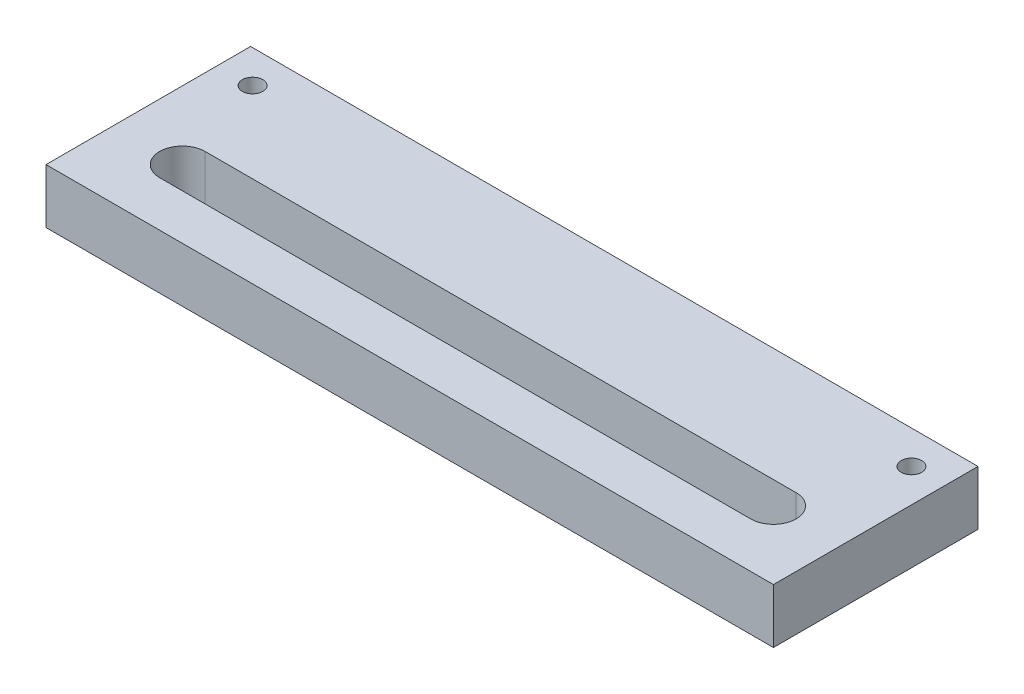
ISO-10303-21;
HEADER;
FILE_DESCRIPTION(('STEP AP214'),'2;1');
FILE_NAME('part.step','',(''),(''),'','','');
FILE_SCHEMA(('AUTOMOTIVE_DESIGN { 1 0 10303 214 1 1 1 1 }'));
ENDSEC;
DATA;
#1=APPLICATION_CONTEXT('core data for automotive mechanical design processes');
#2=APPLICATION_PROTOCOL_DEFINITION('international standard','automotive_design',2000,#1);
#3=PRODUCT_CONTEXT('',#1,'mechanical');
#4=PRODUCT('Part','Part','',(#3));
#5=PRODUCT_RELATED_PRODUCT_CATEGORY('part','',(#4));
#6=PRODUCT_DEFINITION_FORMATION('','',#4);
#7=PRODUCT_DEFINITION_CONTEXT('part definition',#1,'design');
#8=PRODUCT_DEFINITION('design','',#6,#7);
#9=PRODUCT_DEFINITION_SHAPE('','',#8);
#10=(LENGTH_UNIT() NAMED_UNIT(*) SI_UNIT(.MILLI.,.METRE.));
#11=(NAMED_UNIT(*) PLANE_ANGLE_UNIT() SI_UNIT($,.RADIAN.));
#12=(NAMED_UNIT(*) SI_UNIT($,.STERADIAN.) SOLID_ANGLE_UNIT());
#13=UNCERTAINTY_MEASURE_WITH_UNIT(LENGTH_MEASURE(1.E-05),#10,'distance_accuracy_value','');
#14=(GEOMETRIC_REPRESENTATION_CONTEXT(3) GLOBAL_UNCERTAINTY_ASSIGNED_CONTEXT((#13)) GLOBAL_UNIT_ASSIGNED_CONTEXT((#10,
#11,#12)) REPRESENTATION_CONTEXT('',''));
#15=CARTESIAN_POINT('',(0.,0.,0.));
#16=DIRECTION('',(0.,0.,1.));
#17=DIRECTION('',(1.,0.,0.));
#18=AXIS2_PLACEMENT_3D('',#15,#16,#17);
#19=CARTESIAN_POINT('',(0.,12.,0.));
#20=DIRECTION('',(-1.,0.,0.));
#21=DIRECTION('',(0.,0.,1.));
#22=AXIS2_PLACEMENT_3D('',#19,#20,#21);
#23=PLANE('',#22);
#24=DIRECTION('',(0.,0.,-1.));
#25=VECTOR('',#24,1.);
#26=CARTESIAN_POINT('',(0.,0.,0.));
#27=LINE('',#26,#25);
#28=CARTESIAN_POINT('',(0.,0.,45.));
#29=VERTEX_POINT('',#28);
#30=CARTESIAN_POINT('',(0.,0.,0.));
#31=VERTEX_POINT('',#30);
#32=EDGE_CURVE('E165',#29,#31,#27,.T.);
#33=ORIENTED_EDGE('',*,*,#32,.T.);
#34=DIRECTION('',(0.,-1.,0.));
#35=VECTOR('',#34,1.);
#36=CARTESIAN_POINT('',(0.,12.,0.));
#37=LINE('',#36,#35);
#38=CARTESIAN_POINT('',(0.,12.,0.));
#39=VERTEX_POINT('',#38);
#40=EDGE_CURVE('E11',#39,#31,#37,.T.);
#41=ORIENTED_EDGE('',*,*,#40,.F.);
#42=DIRECTION('',(0.,0.,-1.));
#43=VECTOR('',#42,1.);
#44=CARTESIAN_POINT('',(0.,12.,0.));
#45=LINE('',#44,#43);
#46=CARTESIAN_POINT('',(0.,12.,45.));
#47=VERTEX_POINT('',#46);
#48=EDGE_CURVE('E162',#47,#39,#45,.T.);
#49=ORIENTED_EDGE('',*,*,#48,.F.);
#50=DIRECTION('',(0.,-1.,0.));
#51=VECTOR('',#50,1.);
#52=CARTESIAN_POINT('',(0.,12.,45.));
#53=LINE('',#52,#51);
#54=EDGE_CURVE('E172',#47,#29,#53,.T.);
#55=ORIENTED_EDGE('',*,*,#54,.T.);
#56=EDGE_LOOP('',(#33,#41,#49,#55));
#57=FACE_BOUND('',#56,.T.);
#58=ADVANCED_FACE('F36',(#57),#23,.F.);
#59=CARTESIAN_POINT('',(0.,12.,0.));
#60=DIRECTION('',(0.,0.,1.));
#61=DIRECTION('',(1.,0.,0.));
#62=AXIS2_PLACEMENT_3D('',#59,#60,#61);
#63=PLANE('',#62);
#64=DIRECTION('',(-1.,0.,0.));
#65=VECTOR('',#64,1.);
#66=CARTESIAN_POINT('',(0.,0.,0.));
#67=LINE('',#66,#65);
#68=CARTESIAN_POINT('',(-160.,0.,0.));
#69=VERTEX_POINT('',#68);
#70=EDGE_CURVE('E178',#31,#69,#67,.T.);
#71=ORIENTED_EDGE('',*,*,#70,.T.);
#72=DIRECTION('',(0.,-1.,0.));
#73=VECTOR('',#72,1.);
#74=CARTESIAN_POINT('',(-160.,12.,0.));
#75=LINE('',#74,#73);
#76=CARTESIAN_POINT('',(-160.,12.,0.));
#77=VERTEX_POINT('',#76);
#78=EDGE_CURVE('E44',#77,#69,#75,.T.);
#79=ORIENTED_EDGE('',*,*,#78,.F.);
#80=DIRECTION('',(-1.,0.,0.));
#81=VECTOR('',#80,1.);
#82=CARTESIAN_POINT('',(0.,12.,0.));
#83=LINE('',#82,#81);
#84=EDGE_CURVE('E167',#39,#77,#83,.T.);
#85=ORIENTED_EDGE('',*,*,#84,.F.);
#86=ORIENTED_EDGE('',*,*,#40,.T.);
#87=EDGE_LOOP('',(#71,#79,#85,#86));
#88=FACE_BOUND('',#87,.T.);
#89=ADVANCED_FACE('F202',(#88),#63,.F.);
#90=CARTESIAN_POINT('',(-160.,12.,0.));
#91=DIRECTION('',(1.,0.,0.));
#92=DIRECTION('',(0.,0.,-1.));
#93=AXIS2_PLACEMENT_3D('',#90,#91,#92);
#94=PLANE('',#93);
#95=DIRECTION('',(0.,0.,1.));
#96=VECTOR('',#95,1.);
#97=CARTESIAN_POINT('',(-160.,0.,0.));
#98=LINE('',#97,#96);
#99=CARTESIAN_POINT('',(-160.,0.,45.));
#100=VERTEX_POINT('',#99);
#101=EDGE_CURVE('E176',#69,#100,#98,.T.);
#102=ORIENTED_EDGE('',*,*,#101,.T.);
#103=DIRECTION('',(0.,-1.,0.));
#104=VECTOR('',#103,1.);
#105=CARTESIAN_POINT('',(-160.,12.,45.));
#106=LINE('',#105,#104);
#107=CARTESIAN_POINT('',(-160.,12.,45.));
#108=VERTEX_POINT('',#107);
#109=EDGE_CURVE('E181',#108,#100,#106,.T.);
#110=ORIENTED_EDGE('',*,*,#109,.F.);
#111=DIRECTION('',(0.,0.,1.));
#112=VECTOR('',#111,1.);
#113=CARTESIAN_POINT('',(-160.,12.,0.));
#114=LINE('',#113,#112);
#115=EDGE_CURVE('E166',#77,#108,#114,.T.);
#116=ORIENTED_EDGE('',*,*,#115,.F.);
#117=ORIENTED_EDGE('',*,*,#78,.T.);
#118=EDGE_LOOP('',(#102,#110,#116,#117));
#119=FACE_BOUND('',#118,.T.);
#120=ADVANCED_FACE('F186',(#119),#94,.F.);
#121=CARTESIAN_POINT('',(0.,12.,45.));
#122=DIRECTION('',(0.,0.,-1.));
#123=DIRECTION('',(-1.,0.,0.));
#124=AXIS2_PLACEMENT_3D('',#121,#122,#123);
#125=PLANE('',#124);
#126=DIRECTION('',(1.,0.,0.));
#127=VECTOR('',#126,1.);
#128=CARTESIAN_POINT('',(0.,0.,45.));
#129=LINE('',#128,#127);
#130=EDGE_CURVE('E170',#100,#29,#129,.T.);
#131=ORIENTED_EDGE('',*,*,#130,.T.);
#132=ORIENTED_EDGE('',*,*,#54,.F.);
#133=DIRECTION('',(1.,0.,0.));
#134=VECTOR('',#133,1.);
#135=CARTESIAN_POINT('',(0.,12.,45.));
#136=LINE('',#135,#134);
#137=EDGE_CURVE('E173',#108,#47,#136,.T.);
#138=ORIENTED_EDGE('',*,*,#137,.F.);
#139=ORIENTED_EDGE('',*,*,#109,.T.);
#140=EDGE_LOOP('',(#131,#132,#138,#139));
#141=FACE_BOUND('',#140,.T.);
#142=ADVANCED_FACE('F200',(#141),#125,.F.);
#143=CARTESIAN_POINT('',(0.,12.,0.));
#144=DIRECTION('',(0.,-1.,0.));
#145=DIRECTION('',(0.,0.,-1.));
#146=AXIS2_PLACEMENT_3D('',#143,#144,#145);
#147=PLANE('',#146);
#148=DIRECTION('',(1.,0.,0.));
#149=VECTOR('',#148,1.);
#150=CARTESIAN_POINT('',(0.,12.,35.));
#151=LINE('',#150,#149);
#152=CARTESIAN_POINT('',(-145.,12.,35.));
#153=VERTEX_POINT('',#152);
#154=CARTESIAN_POINT('',(-15.,12.,35.));
#155=VERTEX_POINT('',#154);
#156=EDGE_CURVE('E112',#153,#155,#151,.T.);
#157=ORIENTED_EDGE('',*,*,#156,.F.);
#158=CARTESIAN_POINT('',(-145.,12.,30.));
#159=DIRECTION('',(0.,-1.,0.));
#160=DIRECTION('',(0.,0.,-1.));
#161=AXIS2_PLACEMENT_3D('',#158,#159,#160);
#162=CIRCLE('',#161,4.99999999999999);
#163=CARTESIAN_POINT('',(-145.,12.,25.));
#164=VERTEX_POINT('',#163);
#165=EDGE_CURVE('E104',#153,#164,#162,.T.);
#166=ORIENTED_EDGE('',*,*,#165,.T.);
#167=DIRECTION('',(1.,0.,0.));
#168=VECTOR('',#167,1.);
#169=CARTESIAN_POINT('',(0.,12.,25.));
#170=LINE('',#169,#168);
#171=CARTESIAN_POINT('',(-15.,12.,25.));
#172=VERTEX_POINT('',#171);
#173=EDGE_CURVE('E111',#164,#172,#170,.T.);
#174=ORIENTED_EDGE('',*,*,#173,.T.);
#175=CARTESIAN_POINT('',(-15.,12.,30.));
#176=DIRECTION('',(0.,-1.,0.));
#177=DIRECTION('',(0.,0.,-1.));
#178=AXIS2_PLACEMENT_3D('',#175,#176,#177);
#179=CIRCLE('',#178,5.);
#180=EDGE_CURVE('E55',#172,#155,#179,.T.);
#181=ORIENTED_EDGE('',*,*,#180,.T.);
#182=EDGE_LOOP('',(#157,#166,#174,#181));
#183=FACE_BOUND('',#182,.T.);
#184=CARTESIAN_POINT('',(-7.31995414508143,12.,7.31999042270609));
#185=DIRECTION('',(0.,-1.,0.));
#186=DIRECTION('',(0.,0.,-1.));
#187=AXIS2_PLACEMENT_3D('',#184,#185,#186);
#188=CIRCLE('',#187,2.25);
#189=CARTESIAN_POINT('',(-7.31995414508143,12.,5.06999042270609));
#190=VERTEX_POINT('',#189);
#191=EDGE_CURVE('E150',#190,#190,#188,.T.);
#192=ORIENTED_EDGE('',*,*,#191,.T.);
#193=EDGE_LOOP('',(#192));
#194=FACE_BOUND('',#193,.T.);
#195=CARTESIAN_POINT('',(-152.33485324377,12.,7.22227352133084));
#196=DIRECTION('',(0.,-1.,0.));
#197=DIRECTION('',(0.,0.,-1.));
#198=AXIS2_PLACEMENT_3D('',#195,#196,#197);
#199=CIRCLE('',#198,2.25);
#200=CARTESIAN_POINT('',(-152.33485324377,12.,4.97227352133084));
#201=VERTEX_POINT('',#200);
#202=EDGE_CURVE('E157',#201,#201,#199,.T.);
#203=ORIENTED_EDGE('',*,*,#202,.T.);
#204=EDGE_LOOP('',(#203));
#205=FACE_BOUND('',#204,.T.);
#206=ORIENTED_EDGE('',*,*,#48,.T.);
#207=ORIENTED_EDGE('',*,*,#84,.T.);
#208=ORIENTED_EDGE('',*,*,#115,.T.);
#209=ORIENTED_EDGE('',*,*,#137,.T.);
#210=EDGE_LOOP('',(#206,#207,#208,#209));
#211=FACE_BOUND('',#210,.T.);
#212=ADVANCED_FACE('F117',(#183,#194,#205,#211),#147,.F.);
#213=CARTESIAN_POINT('',(0.,0.,0.));
#214=DIRECTION('',(0.,-1.,0.));
#215=DIRECTION('',(0.,0.,-1.));
#216=AXIS2_PLACEMENT_3D('',#213,#214,#215);
#217=PLANE('',#216);
#218=CARTESIAN_POINT('',(-145.,0.,30.));
#219=DIRECTION('',(0.,-1.,0.));
#220=DIRECTION('',(0.,0.,-1.));
#221=AXIS2_PLACEMENT_3D('',#218,#219,#220);
#222=CIRCLE('',#221,4.99999999999999);
#223=CARTESIAN_POINT('',(-145.,0.,35.));
#224=VERTEX_POINT('',#223);
#225=CARTESIAN_POINT('',(-145.,0.,25.));
#226=VERTEX_POINT('',#225);
#227=EDGE_CURVE('E58',#224,#226,#222,.T.);
#228=ORIENTED_EDGE('',*,*,#227,.F.);
#229=DIRECTION('',(1.,0.,0.));
#230=VECTOR('',#229,1.);
#231=CARTESIAN_POINT('',(0.,0.,35.));
#232=LINE('',#231,#230);
#233=CARTESIAN_POINT('',(-15.,0.,35.));
#234=VERTEX_POINT('',#233);
#235=EDGE_CURVE('E116',#224,#234,#232,.T.);
#236=ORIENTED_EDGE('',*,*,#235,.T.);
#237=CARTESIAN_POINT('',(-15.,0.,30.));
#238=DIRECTION('',(0.,-1.,0.));
#239=DIRECTION('',(0.,0.,-1.));
#240=AXIS2_PLACEMENT_3D('',#237,#238,#239);
#241=CIRCLE('',#240,5.);
#242=CARTESIAN_POINT('',(-15.,0.,25.));
#243=VERTEX_POINT('',#242);
#244=EDGE_CURVE('E121',#243,#234,#241,.T.);
#245=ORIENTED_EDGE('',*,*,#244,.F.);
#246=DIRECTION('',(1.,0.,0.));
#247=VECTOR('',#246,1.);
#248=CARTESIAN_POINT('',(0.,0.,25.));
#249=LINE('',#248,#247);
#250=EDGE_CURVE('E129',#226,#243,#249,.T.);
#251=ORIENTED_EDGE('',*,*,#250,.F.);
#252=EDGE_LOOP('',(#228,#236,#245,#251));
#253=FACE_BOUND('',#252,.T.);
#254=CARTESIAN_POINT('',(-7.31995414508143,0.,7.31999042270609));
#255=DIRECTION('',(0.,-1.,0.));
#256=DIRECTION('',(0.,0.,-1.));
#257=AXIS2_PLACEMENT_3D('',#254,#255,#256);
#258=CIRCLE('',#257,4.99999999999999);
#259=CARTESIAN_POINT('',(-7.31995414508143,0.,2.3199904227061));
#260=VERTEX_POINT('',#259);
#261=EDGE_CURVE('E131',#260,#260,#258,.T.);
#262=ORIENTED_EDGE('',*,*,#261,.F.);
#263=EDGE_LOOP('',(#262));
#264=FACE_BOUND('',#263,.T.);
#265=CARTESIAN_POINT('',(-152.33485324377,0.,7.22227352133084));
#266=DIRECTION('',(0.,-1.,0.));
#267=DIRECTION('',(0.,0.,-1.));
#268=AXIS2_PLACEMENT_3D('',#265,#266,#267);
#269=CIRCLE('',#268,5.);
#270=CARTESIAN_POINT('',(-152.33485324377,0.,2.22227352133084));
#271=VERTEX_POINT('',#270);
#272=EDGE_CURVE('E147',#271,#271,#269,.T.);
#273=ORIENTED_EDGE('',*,*,#272,.F.);
#274=EDGE_LOOP('',(#273));
#275=FACE_BOUND('',#274,.T.);
#276=ORIENTED_EDGE('',*,*,#32,.F.);
#277=ORIENTED_EDGE('',*,*,#130,.F.);
#278=ORIENTED_EDGE('',*,*,#101,.F.);
#279=ORIENTED_EDGE('',*,*,#70,.F.);
#280=EDGE_LOOP('',(#276,#277,#278,#279));
#281=FACE_BOUND('',#280,.T.);
#282=ADVANCED_FACE('F198',(#253,#264,#275,#281),#217,.T.);
#283=CARTESIAN_POINT('',(-152.33485324377,0.,7.22227352133084));
#284=DIRECTION('',(0.,-1.,0.));
#285=DIRECTION('',(0.,0.,-1.));
#286=AXIS2_PLACEMENT_3D('',#283,#284,#285);
#287=CYLINDRICAL_SURFACE('',#286,2.25);
#288=ORIENTED_EDGE('',*,*,#202,.F.);
#289=EDGE_LOOP('',(#288));
#290=FACE_BOUND('',#289,.T.);
#291=CARTESIAN_POINT('',(-152.33485324377,5.,7.22227352133084));
#292=DIRECTION('',(0.,-1.,0.));
#293=DIRECTION('',(0.,0.,-1.));
#294=AXIS2_PLACEMENT_3D('',#291,#292,#293);
#295=CIRCLE('',#294,2.25);
#296=CARTESIAN_POINT('',(-152.33485324377,5.,4.97227352133084));
#297=VERTEX_POINT('',#296);
#298=EDGE_CURVE('E156',#297,#297,#295,.T.);
#299=ORIENTED_EDGE('',*,*,#298,.T.);
#300=EDGE_LOOP('',(#299));
#301=FACE_BOUND('',#300,.T.);
#302=ADVANCED_FACE('F220',(#290,#301),#287,.F.);
#303=CARTESIAN_POINT('',(-150.08485324377,5.,7.22227352133084));
#304=DIRECTION('',(0.,1.,0.));
#305=DIRECTION('',(0.,0.,1.));
#306=AXIS2_PLACEMENT_3D('',#303,#304,#305);
#307=PLANE('',#306);
#308=ORIENTED_EDGE('',*,*,#298,.F.);
#309=EDGE_LOOP('',(#308));
#310=FACE_BOUND('',#309,.T.);
#311=CARTESIAN_POINT('',(-152.33485324377,5.,7.22227352133084));
#312=DIRECTION('',(0.,-1.,0.));
#313=DIRECTION('',(0.,0.,-1.));
#314=AXIS2_PLACEMENT_3D('',#311,#312,#313);
#315=CIRCLE('',#314,5.);
#316=CARTESIAN_POINT('',(-152.33485324377,5.,2.22227352133084));
#317=VERTEX_POINT('',#316);
#318=EDGE_CURVE('E153',#317,#317,#315,.T.);
#319=ORIENTED_EDGE('',*,*,#318,.T.);
#320=EDGE_LOOP('',(#319));
#321=FACE_BOUND('',#320,.T.);
#322=ADVANCED_FACE('F224',(#310,#321),#307,.F.);
#323=CARTESIAN_POINT('',(-152.33485324377,0.,7.22227352133084));
#324=DIRECTION('',(0.,-1.,0.));
#325=DIRECTION('',(0.,0.,-1.));
#326=AXIS2_PLACEMENT_3D('',#323,#324,#325);
#327=CYLINDRICAL_SURFACE('',#326,5.);
#328=ORIENTED_EDGE('',*,*,#318,.F.);
#329=EDGE_LOOP('',(#328));
#330=FACE_BOUND('',#329,.T.);
#331=ORIENTED_EDGE('',*,*,#272,.T.);
#332=EDGE_LOOP('',(#331));
#333=FACE_BOUND('',#332,.T.);
#334=ADVANCED_FACE('F229',(#330,#333),#327,.F.);
#335=CARTESIAN_POINT('',(-7.31995414508143,0.,7.31999042270609));
#336=DIRECTION('',(0.,-1.,0.));
#337=DIRECTION('',(0.,0.,-1.));
#338=AXIS2_PLACEMENT_3D('',#335,#336,#337);
#339=CYLINDRICAL_SURFACE('',#338,2.25);
#340=ORIENTED_EDGE('',*,*,#191,.F.);
#341=EDGE_LOOP('',(#340));
#342=FACE_BOUND('',#341,.T.);
#343=CARTESIAN_POINT('',(-7.31995414508143,5.,7.31999042270609));
#344=DIRECTION('',(0.,-1.,0.));
#345=DIRECTION('',(0.,0.,-1.));
#346=AXIS2_PLACEMENT_3D('',#343,#344,#345);
#347=CIRCLE('',#346,2.25000000000001);
#348=CARTESIAN_POINT('',(-7.31995414508143,5.,5.06999042270608));
#349=VERTEX_POINT('',#348);
#350=EDGE_CURVE('E145',#349,#349,#347,.T.);
#351=ORIENTED_EDGE('',*,*,#350,.T.);
#352=EDGE_LOOP('',(#351));
#353=FACE_BOUND('',#352,.T.);
#354=ADVANCED_FACE('F233',(#342,#353),#339,.F.);
#355=CARTESIAN_POINT('',(-5.06995414508142,5.,7.31999042270609));
#356=DIRECTION('',(0.,1.,0.));
#357=DIRECTION('',(0.,0.,1.));
#358=AXIS2_PLACEMENT_3D('',#355,#356,#357);
#359=PLANE('',#358);
#360=ORIENTED_EDGE('',*,*,#350,.F.);
#361=EDGE_LOOP('',(#360));
#362=FACE_BOUND('',#361,.T.);
#363=CARTESIAN_POINT('',(-7.31995414508143,5.,7.31999042270609));
#364=DIRECTION('',(0.,-1.,0.));
#365=DIRECTION('',(0.,0.,-1.));
#366=AXIS2_PLACEMENT_3D('',#363,#364,#365);
#367=CIRCLE('',#366,4.99999999999999);
#368=CARTESIAN_POINT('',(-7.31995414508143,5.,2.3199904227061));
#369=VERTEX_POINT('',#368);
#370=EDGE_CURVE('E143',#369,#369,#367,.T.);
#371=ORIENTED_EDGE('',*,*,#370,.T.);
#372=EDGE_LOOP('',(#371));
#373=FACE_BOUND('',#372,.T.);
#374=ADVANCED_FACE('F232',(#362,#373),#359,.F.);
#375=CARTESIAN_POINT('',(-7.31995414508143,0.,7.31999042270609));
#376=DIRECTION('',(0.,-1.,0.));
#377=DIRECTION('',(0.,0.,-1.));
#378=AXIS2_PLACEMENT_3D('',#375,#376,#377);
#379=CYLINDRICAL_SURFACE('',#378,4.99999999999999);
#380=ORIENTED_EDGE('',*,*,#370,.F.);
#381=EDGE_LOOP('',(#380));
#382=FACE_BOUND('',#381,.T.);
#383=ORIENTED_EDGE('',*,*,#261,.T.);
#384=EDGE_LOOP('',(#383));
#385=FACE_BOUND('',#384,.T.);
#386=ADVANCED_FACE('F239',(#382,#385),#379,.F.);
#387=CARTESIAN_POINT('',(-145.,12.,30.));
#388=DIRECTION('',(0.,-1.,0.));
#389=DIRECTION('',(0.,0.,-1.));
#390=AXIS2_PLACEMENT_3D('',#387,#388,#389);
#391=CYLINDRICAL_SURFACE('',#390,4.99999999999999);
#392=ORIENTED_EDGE('',*,*,#227,.T.);
#393=DIRECTION('',(0.,-1.,0.));
#394=VECTOR('',#393,1.);
#395=CARTESIAN_POINT('',(-145.,12.,25.));
#396=LINE('',#395,#394);
#397=EDGE_CURVE('E101',#164,#226,#396,.T.);
#398=ORIENTED_EDGE('',*,*,#397,.F.);
#399=ORIENTED_EDGE('',*,*,#165,.F.);
#400=DIRECTION('',(0.,-1.,0.));
#401=VECTOR('',#400,1.);
#402=CARTESIAN_POINT('',(-145.,12.,35.));
#403=LINE('',#402,#401);
#404=EDGE_CURVE('E132',#153,#224,#403,.T.);
#405=ORIENTED_EDGE('',*,*,#404,.T.);
#406=EDGE_LOOP('',(#392,#398,#399,#405));
#407=FACE_BOUND('',#406,.T.);
#408=ADVANCED_FACE('F103',(#407),#391,.F.);
#409=CARTESIAN_POINT('',(0.,12.,35.));
#410=DIRECTION('',(0.,0.,-1.));
#411=DIRECTION('',(-1.,0.,0.));
#412=AXIS2_PLACEMENT_3D('',#409,#410,#411);
#413=PLANE('',#412);
#414=ORIENTED_EDGE('',*,*,#235,.F.);
#415=ORIENTED_EDGE('',*,*,#404,.F.);
#416=ORIENTED_EDGE('',*,*,#156,.T.);
#417=DIRECTION('',(0.,-1.,0.));
#418=VECTOR('',#417,1.);
#419=CARTESIAN_POINT('',(-15.,12.,35.));
#420=LINE('',#419,#418);
#421=EDGE_CURVE('E136',#155,#234,#420,.T.);
#422=ORIENTED_EDGE('',*,*,#421,.T.);
#423=EDGE_LOOP('',(#414,#415,#416,#422));
#424=FACE_BOUND('',#423,.T.);
#425=ADVANCED_FACE('F246',(#424),#413,.T.);
#426=CARTESIAN_POINT('',(-15.,12.,30.));
#427=DIRECTION('',(0.,-1.,0.));
#428=DIRECTION('',(0.,0.,-1.));
#429=AXIS2_PLACEMENT_3D('',#426,#427,#428);
#430=CYLINDRICAL_SURFACE('',#429,5.);
#431=ORIENTED_EDGE('',*,*,#244,.T.);
#432=ORIENTED_EDGE('',*,*,#421,.F.);
#433=ORIENTED_EDGE('',*,*,#180,.F.);
#434=DIRECTION('',(0.,-1.,0.));
#435=VECTOR('',#434,1.);
#436=CARTESIAN_POINT('',(-15.,12.,25.));
#437=LINE('',#436,#435);
#438=EDGE_CURVE('E109',#172,#243,#437,.T.);
#439=ORIENTED_EDGE('',*,*,#438,.T.);
#440=EDGE_LOOP('',(#431,#432,#433,#439));
#441=FACE_BOUND('',#440,.T.);
#442=ADVANCED_FACE('F248',(#441),#430,.F.);
#443=CARTESIAN_POINT('',(0.,12.,25.));
#444=DIRECTION('',(0.,0.,-1.));
#445=DIRECTION('',(-1.,0.,0.));
#446=AXIS2_PLACEMENT_3D('',#443,#444,#445);
#447=PLANE('',#446);
#448=ORIENTED_EDGE('',*,*,#250,.T.);
#449=ORIENTED_EDGE('',*,*,#438,.F.);
#450=ORIENTED_EDGE('',*,*,#173,.F.);
#451=ORIENTED_EDGE('',*,*,#397,.T.);
#452=EDGE_LOOP('',(#448,#449,#450,#451));
#453=FACE_BOUND('',#452,.T.);
#454=ADVANCED_FACE('F113',(#453),#447,.F.);
#455=CLOSED_SHELL('',(#58,#89,#120,#142,#212,#282,#302,#322,#334,#354,#374,#386,#408,#425,#442,#454));
#456=MANIFOLD_SOLID_BREP('B2',#455);
#457=ADVANCED_BREP_SHAPE_REPRESENTATION('',(#18,#456),#14);
#458=SHAPE_DEFINITION_REPRESENTATION(#9,#457);
ENDSEC;
END-ISO-10303-21;
